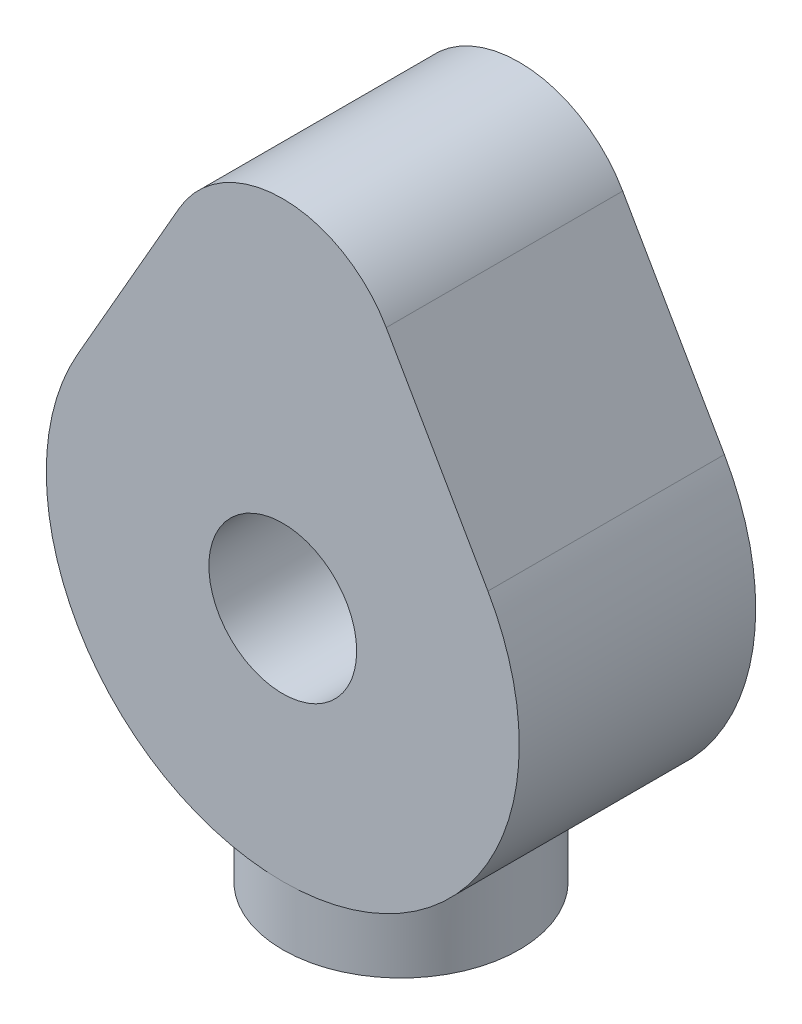
ISO-10303-21;
HEADER;
FILE_DESCRIPTION(('STEP AP214'),'2;1');
FILE_NAME('part.step','',(''),(''),'','','');
FILE_SCHEMA(('AUTOMOTIVE_DESIGN { 1 0 10303 214 1 1 1 1 }'));
ENDSEC;
DATA;
#1=APPLICATION_CONTEXT('core data for automotive mechanical design processes');
#2=APPLICATION_PROTOCOL_DEFINITION('international standard','automotive_design',2000,#1);
#3=PRODUCT_CONTEXT('',#1,'mechanical');
#4=PRODUCT('Part','Part','',(#3));
#5=PRODUCT_RELATED_PRODUCT_CATEGORY('part','',(#4));
#6=PRODUCT_DEFINITION_FORMATION('','',#4);
#7=PRODUCT_DEFINITION_CONTEXT('part definition',#1,'design');
#8=PRODUCT_DEFINITION('design','',#6,#7);
#9=PRODUCT_DEFINITION_SHAPE('','',#8);
#10=(LENGTH_UNIT() NAMED_UNIT(*) SI_UNIT(.MILLI.,.METRE.));
#11=(NAMED_UNIT(*) PLANE_ANGLE_UNIT() SI_UNIT($,.RADIAN.));
#12=(NAMED_UNIT(*) SI_UNIT($,.STERADIAN.) SOLID_ANGLE_UNIT());
#13=UNCERTAINTY_MEASURE_WITH_UNIT(LENGTH_MEASURE(1.E-05),#10,'distance_accuracy_value','');
#14=(GEOMETRIC_REPRESENTATION_CONTEXT(3) GLOBAL_UNCERTAINTY_ASSIGNED_CONTEXT((#13)) GLOBAL_UNIT_ASSIGNED_CONTEXT((#10,
#11,#12)) REPRESENTATION_CONTEXT('',''));
#15=CARTESIAN_POINT('',(0.,0.,0.));
#16=DIRECTION('',(0.,0.,1.));
#17=DIRECTION('',(1.,0.,0.));
#18=AXIS2_PLACEMENT_3D('',#15,#16,#17);
#19=CARTESIAN_POINT('',(0.,-50.,0.));
#20=DIRECTION('',(0.,1.,0.));
#21=DIRECTION('',(0.,0.,1.));
#22=AXIS2_PLACEMENT_3D('',#19,#20,#21);
#23=PLANE('',#22);
#24=CARTESIAN_POINT('',(0.,-50.,0.));
#25=DIRECTION('',(0.,1.,0.));
#26=DIRECTION('',(0.,0.,1.));
#27=AXIS2_PLACEMENT_3D('',#24,#25,#26);
#28=CIRCLE('',#27,20.);
#29=CARTESIAN_POINT('',(0.,-50.,20.));
#30=VERTEX_POINT('',#29);
#31=EDGE_CURVE('E132',#30,#30,#28,.T.);
#32=ORIENTED_EDGE('',*,*,#31,.F.);
#33=EDGE_LOOP('',(#32));
#34=FACE_BOUND('',#33,.T.);
#35=CARTESIAN_POINT('',(0.,-50.,0.));
#36=DIRECTION('',(0.,-1.,0.));
#37=DIRECTION('',(0.,0.,-1.));
#38=AXIS2_PLACEMENT_3D('',#35,#36,#37);
#39=CIRCLE('',#38,10.);
#40=CARTESIAN_POINT('',(0.,-50.,-10.));
#41=VERTEX_POINT('',#40);
#42=EDGE_CURVE('E191',#41,#41,#39,.T.);
#43=ORIENTED_EDGE('',*,*,#42,.F.);
#44=EDGE_LOOP('',(#43));
#45=FACE_BOUND('',#44,.T.);
#46=ADVANCED_FACE('F33',(#34,#45),#23,.F.);
#47=CARTESIAN_POINT('',(0.,0.,20.));
#48=DIRECTION('',(0.,0.,-1.));
#49=DIRECTION('',(-1.,0.,0.));
#50=AXIS2_PLACEMENT_3D('',#47,#48,#49);
#51=CYLINDRICAL_SURFACE('',#50,40.);
#52=CARTESIAN_POINT('',(0.,0.,20.));
#53=DIRECTION('',(0.,0.,1.));
#54=DIRECTION('',(1.,0.,0.));
#55=AXIS2_PLACEMENT_3D('',#52,#53,#54);
#56=CIRCLE('',#55,40.);
#57=CARTESIAN_POINT('',(0.,-40.,20.));
#58=VERTEX_POINT('',#57);
#59=CARTESIAN_POINT('',(34.7008119092264,19.8960712916015,20.));
#60=VERTEX_POINT('',#59);
#61=EDGE_CURVE('E174',#58,#60,#56,.T.);
#62=ORIENTED_EDGE('',*,*,#61,.F.);
#63=CARTESIAN_POINT('',(0.,-40.,20.));
#64=CARTESIAN_POINT('',(0.525955495309158,-39.9999984020735,19.9999982623809));
#65=CARTESIAN_POINT('',(1.05194776389316,-39.9896021674005,19.9792289721094));
#66=CARTESIAN_POINT('',(2.1000584622648,-39.9482790708451,19.8963883502823));
#67=CARTESIAN_POINT('',(2.62217510685011,-39.9173432774939,19.8342990510119));
#68=CARTESIAN_POINT('',(3.65926452101893,-39.8356724459412,19.669416179119));
#69=CARTESIAN_POINT('',(4.17422377794313,-39.7849041497218,19.5665542287244));
#70=CARTESIAN_POINT('',(5.1923636555662,-39.6648726897732,19.3213235720522));
#71=CARTESIAN_POINT('',(5.69554544879778,-39.5956113757509,19.1789588168648));
#72=CARTESIAN_POINT('',(6.68493673827045,-39.440606046303,18.8568619944931));
#73=CARTESIAN_POINT('',(7.17120492069962,-39.3549275595753,18.677278260756));
#74=CARTESIAN_POINT('',(8.12596863493543,-39.1689317521732,18.2821113609648));
#75=CARTESIAN_POINT('',(8.59446378382129,-39.0686141163229,18.0665274198246));
#76=CARTESIAN_POINT('',(9.51109783249333,-38.8556352457488,17.6012260637177));
#77=CARTESIAN_POINT('',(9.95924110879068,-38.742976682795,17.3515160340503));
#78=CARTESIAN_POINT('',(10.8331914713298,-38.5077498342666,16.8197401238515));
#79=CARTESIAN_POINT('',(11.2589965294644,-38.3851806514563,16.5376713128202));
#80=CARTESIAN_POINT('',(12.1114280320356,-38.1251058372724,15.9249873049685));
#81=CARTESIAN_POINT('',(12.5365475155568,-37.987145188738,15.5924680344565));
#82=CARTESIAN_POINT('',(13.3576238086493,-37.7062619973265,14.8951014231951));
#83=CARTESIAN_POINT('',(13.7535796129841,-37.5633392836627,14.5302529690522));
#84=CARTESIAN_POINT('',(14.5147245681412,-37.2758414912841,13.7699763380488));
#85=CARTESIAN_POINT('',(14.8798984189062,-37.1312656309511,13.37453313928));
#86=CARTESIAN_POINT('',(15.5776736613917,-36.8439755178979,12.5549154289558));
#87=CARTESIAN_POINT('',(15.9102597020839,-36.701262169722,12.1307275343761));
#88=CARTESIAN_POINT('',(16.5654339419528,-36.4105018826193,11.2215973279371));
#89=CARTESIAN_POINT('',(16.885233355286,-36.2629032277113,10.7344956827348));
#90=CARTESIAN_POINT('',(17.4822019569123,-35.978908696181,9.73204750758799));
#91=CARTESIAN_POINT('',(17.7593921236657,-35.8425073221447,9.21671504756661));
#92=CARTESIAN_POINT('',(18.2687755534357,-35.5855763271304,8.16060160021829));
#93=CARTESIAN_POINT('',(18.5009808934698,-35.4650424490192,7.61982749176702));
#94=CARTESIAN_POINT('',(18.9178904493833,-35.2444199123124,6.51622809145552));
#95=CARTESIAN_POINT('',(19.1025999287154,-35.1443289884985,5.95340525099053));
#96=CARTESIAN_POINT('',(19.4125091752965,-34.9740458186312,4.84416991997306));
#97=CARTESIAN_POINT('',(19.5406061549145,-34.9024240111369,4.29878748934329));
#98=CARTESIAN_POINT('',(19.75086442124,-34.7838755031915,3.19656707002509));
#99=CARTESIAN_POINT('',(19.833027672922,-34.7369477463717,2.63972957242357));
#100=CARTESIAN_POINT('',(19.9500955461198,-34.6698466392678,1.519970797152));
#101=CARTESIAN_POINT('',(19.9850401406704,-34.6496506594487,0.957055072508461));
#102=CARTESIAN_POINT('',(20.007216012279,-34.6368519800813,-0.170005002878221));
#103=CARTESIAN_POINT('',(19.9944518416021,-34.644246647894,-0.734149231266727));
#104=CARTESIAN_POINT('',(19.9258258183558,-34.683752706684,-1.79091472657764));
#105=CARTESIAN_POINT('',(19.8753086844342,-34.7127978098405,-2.28400999566694));
#106=CARTESIAN_POINT('',(19.7381397437616,-34.7909769339568,-3.26348526201604));
#107=CARTESIAN_POINT('',(19.6514913279473,-34.8401090697315,-3.74986588502405));
#108=CARTESIAN_POINT('',(19.443037128277,-34.9568668301204,-4.7128668190479));
#109=CARTESIAN_POINT('',(19.3212225365264,-35.0244970876425,-5.18948465275855));
#110=CARTESIAN_POINT('',(19.043705831017,-35.1761601127151,-6.13006796016611));
#111=CARTESIAN_POINT('',(18.8880019121776,-35.2601937539506,-6.59403275843009));
#112=CARTESIAN_POINT('',(18.5401581257189,-35.4443524571232,-7.51741518121851));
#113=CARTESIAN_POINT('',(18.3472621362356,-35.5448033610596,-7.97648237425849));
#114=CARTESIAN_POINT('',(17.928965335398,-35.7576181997024,-8.87686508191131));
#115=CARTESIAN_POINT('',(17.7035528986985,-35.8699863912804,-9.31817417513477));
#116=CARTESIAN_POINT('',(17.2217453818263,-36.1037834145776,-10.1811473523825));
#117=CARTESIAN_POINT('',(16.9653434339075,-36.2252142524277,-10.60280705301));
#118=CARTESIAN_POINT('',(16.4230793770433,-36.4742577002614,-11.4247489211605));
#119=CARTESIAN_POINT('',(16.1372187212183,-36.6018700051652,-11.8250321416514));
#120=CARTESIAN_POINT('',(15.4992958964165,-36.8769204872628,-12.652198617368));
#121=CARTESIAN_POINT('',(15.1434365215041,-37.0248188034542,-13.0760069635647));
#122=CARTESIAN_POINT('',(14.3979314861535,-37.3210457502805,-13.8926336443529));
#123=CARTESIAN_POINT('',(14.0082842982153,-37.4693744000769,-14.2854505763309));
#124=CARTESIAN_POINT('',(13.1968254432884,-37.7628128869945,-15.038294137795));
#125=CARTESIAN_POINT('',(12.7749919492543,-37.9079204520951,-15.3982981456179));
#126=CARTESIAN_POINT('',(11.9015900642709,-38.191135390742,-16.0829073614934));
#127=CARTESIAN_POINT('',(11.4500336472376,-38.329245544001,-16.4075266860173));
#128=CARTESIAN_POINT('',(10.4974553627396,-38.6012960666301,-17.0335917325386));
#129=CARTESIAN_POINT('',(9.99510749644099,-38.7347387181026,-17.3332416925276));
#130=CARTESIAN_POINT('',(8.96305995725755,-38.986480307297,-17.8887384732091));
#131=CARTESIAN_POINT('',(8.43335901213671,-39.1047785397354,-18.1445832540588));
#132=CARTESIAN_POINT('',(7.35052045530497,-39.3226984638096,-18.6095886062783));
#133=CARTESIAN_POINT('',(6.7973980130011,-39.4223320238495,-18.8187788603449));
#134=CARTESIAN_POINT('',(5.67164529023391,-39.5999620401594,-19.1881015579119));
#135=CARTESIAN_POINT('',(5.099017262336,-39.677960985414,-19.3482396449093));
#136=CARTESIAN_POINT('',(3.98720164165299,-39.8043826338148,-19.606131722384));
#137=CARTESIAN_POINT('',(3.44917316982603,-39.8547200827768,-19.7079544863071));
#138=CARTESIAN_POINT('',(2.36501188798831,-39.9337205093502,-19.8672303157948));
#139=CARTESIAN_POINT('',(1.81887952044227,-39.9623846658944,-19.9246857947506));
#140=CARTESIAN_POINT('',(0.72324290613407,-39.9972152184308,-19.9944526430536));
#141=CARTESIAN_POINT('',(0.173740095620136,-40.0033906096215,-20.0067820622174));
#142=CARTESIAN_POINT('',(-0.92419057742115,-39.9930894634341,-19.9861776191785));
#143=CARTESIAN_POINT('',(-1.47261848644562,-39.9766139285379,-19.9532457601443));
#144=CARTESIAN_POINT('',(-2.52139154289439,-39.923634267081,-19.8468758957505));
#145=CARTESIAN_POINT('',(-3.02216423520807,-39.8887842879419,-19.7767809232378));
#146=CARTESIAN_POINT('',(-4.01540678602407,-39.8010682287016,-19.5992599407683));
#147=CARTESIAN_POINT('',(-4.50787717661253,-39.7482033078017,-19.4918363327758));
#148=CARTESIAN_POINT('',(-5.48136857498477,-39.6256901924867,-19.2407722721667));
#149=CARTESIAN_POINT('',(-5.96238894437366,-39.5560410646668,-19.0971298053229));
#150=CARTESIAN_POINT('',(-6.91010293848646,-39.4015358531269,-18.7750097266352));
#151=CARTESIAN_POINT('',(-7.37679596029165,-39.3166791304706,-18.5965306511276));
#152=CARTESIAN_POINT('',(-8.30639914139648,-39.130994956507,-18.2007191617701));
#153=CARTESIAN_POINT('',(-8.76882149944907,-39.0297809280574,-17.9824235312199));
#154=CARTESIAN_POINT('',(-9.67344906544454,-38.815467201885,-17.5124022383474));
#155=CARTESIAN_POINT('',(-10.1156540957074,-38.7023673997328,-17.2606762822985));
#156=CARTESIAN_POINT('',(-10.9779473425004,-38.4666677014398,-16.7254970593208));
#157=CARTESIAN_POINT('',(-11.3980286356791,-38.3440648607605,-16.4420339463705));
#158=CARTESIAN_POINT('',(-12.2141818502455,-38.0919444279185,-15.8451696484874));
#159=CARTESIAN_POINT('',(-12.6102516617017,-37.9624262299663,-15.5317658388271));
#160=CARTESIAN_POINT('',(-13.4144484673574,-37.6862126417981,-14.8444984736278));
#161=CARTESIAN_POINT('',(-13.8199379336654,-37.5390796962588,-14.4677200352175));
#162=CARTESIAN_POINT('',(-14.5980879442184,-37.2433768374063,-13.6821610517212));
#163=CARTESIAN_POINT('',(-14.9707464600886,-37.0948068359368,-13.2733785322891));
#164=CARTESIAN_POINT('',(-15.6814902855054,-36.7999858258588,-12.4256561293184));
#165=CARTESIAN_POINT('',(-16.0195601033512,-36.6537358809282,-11.9867028786816));
#166=CARTESIAN_POINT('',(-16.6591396993238,-36.3675115698269,-11.0806458913586));
#167=CARTESIAN_POINT('',(-16.960632115893,-36.2275402035119,-10.6135289429463));
#168=CARTESIAN_POINT('',(-17.5385670688271,-35.9514421280783,-9.63013638298287));
#169=CARTESIAN_POINT('',(-17.8130759401747,-35.8158342014911,-9.11257468960894));
#170=CARTESIAN_POINT('',(-18.3167730157601,-35.5608707827718,-8.05233179362844));
#171=CARTESIAN_POINT('',(-18.545986567415,-35.4415062125134,-7.50966485104502));
#172=CARTESIAN_POINT('',(-18.9565535489441,-35.2236159110851,-6.40290087540963));
#173=CARTESIAN_POINT('',(-19.1379435504527,-35.1250742677182,-5.83882059743459));
#174=CARTESIAN_POINT('',(-19.4506018803025,-34.9529120161132,-4.6932334086418));
#175=CARTESIAN_POINT('',(-19.5818779692058,-34.8792875494405,-4.11172921111925));
#176=CARTESIAN_POINT('',(-19.7821512677084,-34.7660521740885,-2.99295044340003));
#177=CARTESIAN_POINT('',(-19.8559171496972,-34.7238546261086,-2.45678849964083));
#178=CARTESIAN_POINT('',(-19.9597538525093,-34.6642736285747,-1.37887867241344));
#179=CARTESIAN_POINT('',(-19.9898276449507,-34.6468884914625,-0.837131171358394));
#180=CARTESIAN_POINT('',(-20.0058193338474,-34.63765684696,0.247027138688521));
#181=CARTESIAN_POINT('',(-19.9917535623708,-34.6458008935224,0.789437628127308));
#182=CARTESIAN_POINT('',(-19.9197179789316,-34.6872679809353,1.87034420698098));
#183=CARTESIAN_POINT('',(-19.8617499643071,-34.7205899910114,2.40884045573197));
#184=CARTESIAN_POINT('',(-19.7103796808069,-34.8067187032581,3.42632818218793));
#185=CARTESIAN_POINT('',(-19.6208878161443,-34.8573619627895,3.90609324105171));
#186=CARTESIAN_POINT('',(-19.4077148769991,-34.9764992495754,4.85565155229128));
#187=CARTESIAN_POINT('',(-19.2840365265261,-35.0449918545533,5.32544559595627));
#188=CARTESIAN_POINT('',(-19.003715757486,-35.1977873125033,6.25246548720163));
#189=CARTESIAN_POINT('',(-18.8470706643695,-35.2820914481843,6.70969031165259));
#190=CARTESIAN_POINT('',(-18.5021293041308,-35.4641965231368,7.60943192979274));
#191=CARTESIAN_POINT('',(-18.3138213268244,-35.5620024535006,8.05194320904224));
#192=CARTESIAN_POINT('',(-17.893358939359,-35.7755075101083,8.94926640728481));
#193=CARTESIAN_POINT('',(-17.6591125277565,-35.8919663280285,9.40291703303953));
#194=CARTESIAN_POINT('',(-17.1578911973716,-36.1342528675245,10.2891181996718));
#195=CARTESIAN_POINT('',(-16.8909154185148,-36.2600808352722,10.7216681856411));
#196=CARTESIAN_POINT('',(-16.3256587085201,-36.5180697545457,11.5641839038469));
#197=CARTESIAN_POINT('',(-16.0273598441956,-36.6502343101261,11.9741364914935));
#198=CARTESIAN_POINT('',(-15.4011806538846,-36.9177399868863,12.7694857607962));
#199=CARTESIAN_POINT('',(-15.0733074988073,-37.0530803321721,13.1548883566514));
#200=CARTESIAN_POINT('',(-14.3476774582267,-37.3405191134944,13.945101118966));
#201=CARTESIAN_POINT('',(-13.9462727129583,-37.4926510381637,14.3465583211664));
#202=CARTESIAN_POINT('',(-13.1100029869322,-37.7931905607215,15.1145676799867));
#203=CARTESIAN_POINT('',(-12.6751351529993,-37.9415978396004,15.4811168542557));
#204=CARTESIAN_POINT('',(-11.7738674911855,-38.2308792747587,16.1771564685064));
#205=CARTESIAN_POINT('',(-11.3074491783242,-38.3717489267631,16.5066248769793));
#206=CARTESIAN_POINT('',(-10.3457908817124,-38.6421277118512,17.1257582515873));
#207=CARTESIAN_POINT('',(-9.85055256101203,-38.7716374993732,17.4154255112003));
#208=CARTESIAN_POINT('',(-8.8304447952247,-39.0166672192426,17.9543405914455));
#209=CARTESIAN_POINT('',(-8.30538870726552,-39.1320804342946,18.2032844105791));
#210=CARTESIAN_POINT('',(-7.23229606753359,-39.3445425296377,18.6556405850082));
#211=CARTESIAN_POINT('',(-6.68425623664172,-39.4415887785278,18.8590464169238));
#212=CARTESIAN_POINT('',(-5.57078900539141,-39.6141755158587,19.2173750047436));
#213=CARTESIAN_POINT('',(-5.00540887409184,-39.6897695534438,19.3724185806038));
#214=CARTESIAN_POINT('',(-3.86094644442428,-39.8173857455874,19.6325521753264));
#215=CARTESIAN_POINT('',(-3.28187274376231,-39.8694222981838,19.7376727084559));
#216=CARTESIAN_POINT('',(-2.2521670464681,-39.939055332577,19.8778978078802));
#217=CARTESIAN_POINT('',(-1.80330336007387,-39.9618696173926,19.9236469328593));
#218=CARTESIAN_POINT('',(-0.902968863044381,-39.9923428461159,19.9846991949116));
#219=CARTESIAN_POINT('',(-0.45149798079361,-40.0000013717142,20.000001491631));
#220=CARTESIAN_POINT('',(0.,-40.,20.));
#221=B_SPLINE_CURVE_WITH_KNOTS('',3,(#63,#64,#65,#66,#67,#68,#69,#70,#71,#72,#73,#74,#75,#76,
#77,#78,#79,#80,#81,#82,#83,#84,#85,#86,#87,#88,#89,#90,#91,#92,#93,#94,#95,#96,#97,#98,#99,
#100,#101,#102,#103,#104,#105,#106,#107,#108,#109,#110,#111,#112,#113,#114,#115,#116,#117,#118,
#119,#120,#121,#122,#123,#124,#125,#126,#127,#128,#129,#130,#131,#132,#133,#134,#135,#136,#137,
#138,#139,#140,#141,#142,#143,#144,#145,#146,#147,#148,#149,#150,#151,#152,#153,#154,#155,#156,
#157,#158,#159,#160,#161,#162,#163,#164,#165,#166,#167,#168,#169,#170,#171,#172,#173,#174,#175,
#176,#177,#178,#179,#180,#181,#182,#183,#184,#185,#186,#187,#188,#189,#190,#191,#192,#193,#194,
#195,#196,#197,#198,#199,#200,#201,#202,#203,#204,#205,#206,#207,#208,#209,#210,#211,#212,#213,
#214,#215,#216,#217,#218,#219,#220),.UNSPECIFIED.,.T.,.F.,(4,2,2,2,2,2,2,2,2,2,2,2,2,2,2,2,2,2,
2,2,2,2,2,2,2,2,2,2,2,2,2,2,2,2,2,2,2,2,2,2,2,2,2,2,2,2,2,2,2,2,2,2,2,2,2,2,2,2,2,2,2,2,2,2,2,2,
2,2,2,2,2,2,2,2,2,2,2,2,4),(0.,1.577421178502,3.15552873607903,4.73629413277893,
6.31690147748929,7.8913265620635,9.46578554845364,11.03990434081,12.614165802382,
14.283611125627,15.9531139657086,17.623441792188,19.2945527091499,21.0956182288859,
22.8957941426434,24.6954860937523,26.4949785184317,28.186906492579,29.8787620831016,
31.5691845311993,33.2594456870341,34.7472712538931,36.2349572190898,37.7230161212401,
39.2111543027408,40.7335431715167,42.2564776830213,43.7797503209208,45.3029478557305,
47.019529486175,48.7361887613817,50.4540227113041,52.1711688156636,53.968685154222,
55.7662851736146,57.5627382345732,59.3589845342626,61.0064389586203,62.6538037621639,
64.3005095698929,65.947142500251,67.4659444431998,68.9846486747565,70.5034373841301,
72.0222899193056,73.5844756323281,75.1466750719843,76.7093605127759,78.272183071078,
79.9885258414882,81.7049745774131,83.4221887473444,85.140214834696,86.941867404936,
88.7425088911977,90.5417693701602,92.3407511053169,93.9670431899161,95.5932246607814,
97.2188044996406,98.8443177915912,100.31467320725,101.784911497437,103.255269112177,
104.726171724143,106.295593599237,107.865056725022,109.435423355,111.005410234871,
112.766606050411,114.527952198152,116.290339384542,118.052624973548,119.827518576261,
121.602666272496,123.373343053535,125.142936153316,126.49701045587,127.8511221313),.UNSPECIFIED.);
#222=CARTESIAN_POINT('',(0.,-40.,-20.));
#223=VERTEX_POINT('',#222);
#224=EDGE_CURVE('E47',#58,#223,#221,.T.);
#225=ORIENTED_EDGE('',*,*,#224,.T.);
#226=CARTESIAN_POINT('',(0.,0.,-20.));
#227=DIRECTION('',(0.,0.,1.));
#228=DIRECTION('',(1.,0.,0.));
#229=AXIS2_PLACEMENT_3D('',#226,#227,#228);
#230=CIRCLE('',#229,40.);
#231=CARTESIAN_POINT('',(34.7008119092264,19.8960712916015,-20.));
#232=VERTEX_POINT('',#231);
#233=EDGE_CURVE('E155',#223,#232,#230,.T.);
#234=ORIENTED_EDGE('',*,*,#233,.T.);
#235=DIRECTION('',(0.,0.,-1.));
#236=VECTOR('',#235,1.);
#237=CARTESIAN_POINT('',(34.7008119092264,19.8960712916015,20.));
#238=LINE('',#237,#236);
#239=EDGE_CURVE('E162',#60,#232,#238,.T.);
#240=ORIENTED_EDGE('',*,*,#239,.F.);
#241=EDGE_LOOP('',(#62,#225,#234,#240));
#242=FACE_BOUND('',#241,.T.);
#243=ADVANCED_FACE('F107',(#242),#51,.T.);
#244=CARTESIAN_POINT('',(0.,39.8622643445528,20.));
#245=DIRECTION('',(0.,0.,-1.));
#246=DIRECTION('',(-1.,0.,0.));
#247=AXIS2_PLACEMENT_3D('',#244,#245,#246);
#248=CYLINDRICAL_SURFACE('',#247,20.1724386689028);
#249=CARTESIAN_POINT('',(0.,39.8622643445528,-20.));
#250=DIRECTION('',(0.,0.,1.));
#251=DIRECTION('',(-1.,0.,0.));
#252=AXIS2_PLACEMENT_3D('',#249,#250,#251);
#253=CIRCLE('',#252,20.1724386689028);
#254=CARTESIAN_POINT('',(17.5,49.8960712916016,-20.));
#255=VERTEX_POINT('',#254);
#256=CARTESIAN_POINT('',(-17.5,49.8960712916016,-20.));
#257=VERTEX_POINT('',#256);
#258=EDGE_CURVE('E156',#255,#257,#253,.T.);
#259=ORIENTED_EDGE('',*,*,#258,.T.);
#260=DIRECTION('',(0.,0.,-1.));
#261=VECTOR('',#260,1.);
#262=CARTESIAN_POINT('',(-17.5,49.8960712916016,20.));
#263=LINE('',#262,#261);
#264=CARTESIAN_POINT('',(-17.5,49.8960712916016,20.));
#265=VERTEX_POINT('',#264);
#266=EDGE_CURVE('E11',#265,#257,#263,.T.);
#267=ORIENTED_EDGE('',*,*,#266,.F.);
#268=CARTESIAN_POINT('',(0.,39.8622643445528,20.));
#269=DIRECTION('',(0.,0.,1.));
#270=DIRECTION('',(-1.,0.,0.));
#271=AXIS2_PLACEMENT_3D('',#268,#269,#270);
#272=CIRCLE('',#271,20.1724386689028);
#273=CARTESIAN_POINT('',(17.5,49.8960712916016,20.));
#274=VERTEX_POINT('',#273);
#275=EDGE_CURVE('E134',#274,#265,#272,.T.);
#276=ORIENTED_EDGE('',*,*,#275,.F.);
#277=DIRECTION('',(0.,0.,-1.));
#278=VECTOR('',#277,1.);
#279=CARTESIAN_POINT('',(17.5,49.8960712916016,20.));
#280=LINE('',#279,#278);
#281=EDGE_CURVE('E168',#274,#255,#280,.T.);
#282=ORIENTED_EDGE('',*,*,#281,.T.);
#283=EDGE_LOOP('',(#259,#267,#276,#282));
#284=FACE_BOUND('',#283,.T.);
#285=ADVANCED_FACE('F35',(#284),#248,.T.);
#286=CARTESIAN_POINT('',(-17.5,49.8960712916016,20.));
#287=DIRECTION('',(0.86752029773066,-0.497401782290039,0.));
#288=DIRECTION('',(0.497401782290039,0.86752029773066,0.));
#289=AXIS2_PLACEMENT_3D('',#286,#287,#288);
#290=PLANE('',#289);
#291=DIRECTION('',(-0.497401782290039,-0.86752029773066,0.));
#292=VECTOR('',#291,1.);
#293=CARTESIAN_POINT('',(-17.5,49.8960712916016,-20.));
#294=LINE('',#293,#292);
#295=CARTESIAN_POINT('',(-34.7008119092264,19.8960712916015,-20.));
#296=VERTEX_POINT('',#295);
#297=EDGE_CURVE('E147',#257,#296,#294,.T.);
#298=ORIENTED_EDGE('',*,*,#297,.T.);
#299=DIRECTION('',(0.,0.,-1.));
#300=VECTOR('',#299,1.);
#301=CARTESIAN_POINT('',(-34.7008119092264,19.8960712916015,20.));
#302=LINE('',#301,#300);
#303=CARTESIAN_POINT('',(-34.7008119092264,19.8960712916015,20.));
#304=VERTEX_POINT('',#303);
#305=EDGE_CURVE('E41',#304,#296,#302,.T.);
#306=ORIENTED_EDGE('',*,*,#305,.F.);
#307=DIRECTION('',(-0.497401782290039,-0.86752029773066,0.));
#308=VECTOR('',#307,1.);
#309=CARTESIAN_POINT('',(-17.5,49.8960712916016,20.));
#310=LINE('',#309,#308);
#311=EDGE_CURVE('E84',#265,#304,#310,.T.);
#312=ORIENTED_EDGE('',*,*,#311,.F.);
#313=ORIENTED_EDGE('',*,*,#266,.T.);
#314=EDGE_LOOP('',(#298,#306,#312,#313));
#315=FACE_BOUND('',#314,.T.);
#316=ADVANCED_FACE('F140',(#315),#290,.F.);
#317=EDGE_CURVE('E159',#296,#223,#230,.T.);
#318=ORIENTED_EDGE('',*,*,#317,.T.);
#319=EDGE_CURVE('E127',#223,#58,#221,.T.);
#320=ORIENTED_EDGE('',*,*,#319,.T.);
#321=EDGE_CURVE('E161',#304,#58,#56,.T.);
#322=ORIENTED_EDGE('',*,*,#321,.F.);
#323=ORIENTED_EDGE('',*,*,#305,.T.);
#324=EDGE_LOOP('',(#318,#320,#322,#323));
#325=FACE_BOUND('',#324,.T.);
#326=ADVANCED_FACE('F115',(#325),#51,.T.);
#327=CARTESIAN_POINT('',(17.5,49.8960712916016,20.));
#328=DIRECTION('',(-0.86752029773066,-0.497401782290039,0.));
#329=DIRECTION('',(0.497401782290039,-0.86752029773066,0.));
#330=AXIS2_PLACEMENT_3D('',#327,#328,#329);
#331=PLANE('',#330);
#332=DIRECTION('',(-0.497401782290039,0.86752029773066,0.));
#333=VECTOR('',#332,1.);
#334=CARTESIAN_POINT('',(17.5,49.8960712916016,-20.));
#335=LINE('',#334,#333);
#336=EDGE_CURVE('E77',#232,#255,#335,.T.);
#337=ORIENTED_EDGE('',*,*,#336,.T.);
#338=ORIENTED_EDGE('',*,*,#281,.F.);
#339=DIRECTION('',(-0.497401782290039,0.86752029773066,0.));
#340=VECTOR('',#339,1.);
#341=CARTESIAN_POINT('',(17.5,49.8960712916016,20.));
#342=LINE('',#341,#340);
#343=EDGE_CURVE('E56',#60,#274,#342,.T.);
#344=ORIENTED_EDGE('',*,*,#343,.F.);
#345=ORIENTED_EDGE('',*,*,#239,.T.);
#346=EDGE_LOOP('',(#337,#338,#344,#345));
#347=FACE_BOUND('',#346,.T.);
#348=ADVANCED_FACE('F139',(#347),#331,.F.);
#349=CARTESIAN_POINT('',(0.,39.8622643445528,20.));
#350=DIRECTION('',(0.,0.,-1.));
#351=DIRECTION('',(-1.,0.,0.));
#352=AXIS2_PLACEMENT_3D('',#349,#350,#351);
#353=PLANE('',#352);
#354=CARTESIAN_POINT('',(0.,0.,20.));
#355=DIRECTION('',(0.,0.,1.));
#356=DIRECTION('',(1.,0.,0.));
#357=AXIS2_PLACEMENT_3D('',#354,#355,#356);
#358=CIRCLE('',#357,12.5);
#359=CARTESIAN_POINT('',(12.5,0.,20.));
#360=VERTEX_POINT('',#359);
#361=EDGE_CURVE('E185',#360,#360,#358,.T.);
#362=ORIENTED_EDGE('',*,*,#361,.F.);
#363=EDGE_LOOP('',(#362));
#364=FACE_BOUND('',#363,.T.);
#365=ORIENTED_EDGE('',*,*,#275,.T.);
#366=ORIENTED_EDGE('',*,*,#311,.T.);
#367=ORIENTED_EDGE('',*,*,#321,.T.);
#368=ORIENTED_EDGE('',*,*,#61,.T.);
#369=ORIENTED_EDGE('',*,*,#343,.T.);
#370=EDGE_LOOP('',(#365,#366,#367,#368,#369));
#371=FACE_BOUND('',#370,.T.);
#372=ADVANCED_FACE('F124',(#364,#371),#353,.F.);
#373=CARTESIAN_POINT('',(0.,39.8622643445528,-20.));
#374=DIRECTION('',(0.,0.,-1.));
#375=DIRECTION('',(-1.,0.,0.));
#376=AXIS2_PLACEMENT_3D('',#373,#374,#375);
#377=PLANE('',#376);
#378=CARTESIAN_POINT('',(0.,0.,-20.));
#379=DIRECTION('',(0.,0.,1.));
#380=DIRECTION('',(1.,0.,0.));
#381=AXIS2_PLACEMENT_3D('',#378,#379,#380);
#382=CIRCLE('',#381,12.5);
#383=CARTESIAN_POINT('',(12.5,0.,-20.));
#384=VERTEX_POINT('',#383);
#385=EDGE_CURVE('E187',#384,#384,#382,.T.);
#386=ORIENTED_EDGE('',*,*,#385,.T.);
#387=EDGE_LOOP('',(#386));
#388=FACE_BOUND('',#387,.T.);
#389=ORIENTED_EDGE('',*,*,#258,.F.);
#390=ORIENTED_EDGE('',*,*,#336,.F.);
#391=ORIENTED_EDGE('',*,*,#233,.F.);
#392=ORIENTED_EDGE('',*,*,#317,.F.);
#393=ORIENTED_EDGE('',*,*,#297,.F.);
#394=EDGE_LOOP('',(#389,#390,#391,#392,#393));
#395=FACE_BOUND('',#394,.T.);
#396=ADVANCED_FACE('F122',(#388,#395),#377,.T.);
#397=CARTESIAN_POINT('',(0.,-50.,0.));
#398=DIRECTION('',(0.,1.,0.));
#399=DIRECTION('',(0.,0.,1.));
#400=AXIS2_PLACEMENT_3D('',#397,#398,#399);
#401=CYLINDRICAL_SURFACE('',#400,20.);
#402=ORIENTED_EDGE('',*,*,#31,.T.);
#403=EDGE_LOOP('',(#402));
#404=FACE_BOUND('',#403,.T.);
#405=ORIENTED_EDGE('',*,*,#224,.F.);
#406=ORIENTED_EDGE('',*,*,#319,.F.);
#407=EDGE_LOOP('',(#405,#406));
#408=FACE_BOUND('',#407,.T.);
#409=ADVANCED_FACE('F102',(#404,#408),#401,.T.);
#410=CARTESIAN_POINT('',(0.,0.,-20.));
#411=DIRECTION('',(0.,0.,1.));
#412=DIRECTION('',(1.,0.,0.));
#413=AXIS2_PLACEMENT_3D('',#410,#411,#412);
#414=CYLINDRICAL_SURFACE('',#413,12.5);
#415=ORIENTED_EDGE('',*,*,#385,.F.);
#416=EDGE_LOOP('',(#415));
#417=FACE_BOUND('',#416,.T.);
#418=ORIENTED_EDGE('',*,*,#361,.T.);
#419=EDGE_LOOP('',(#418));
#420=FACE_BOUND('',#419,.T.);
#421=ADVANCED_FACE('F93',(#417,#420),#414,.F.);
#422=CARTESIAN_POINT('',(0.,-20.,0.));
#423=DIRECTION('',(0.,-1.,0.));
#424=DIRECTION('',(0.,0.,-1.));
#425=AXIS2_PLACEMENT_3D('',#422,#423,#424);
#426=CONICAL_SURFACE('',#425,0.,1.04719755119659);
#427=CARTESIAN_POINT('',(0.,-25.7735026918963,0.));
#428=DIRECTION('',(0.,-1.,0.));
#429=DIRECTION('',(0.,0.,-1.));
#430=AXIS2_PLACEMENT_3D('',#427,#428,#429);
#431=CIRCLE('',#430,10.);
#432=CARTESIAN_POINT('',(0.,-25.7735026918963,-10.));
#433=VERTEX_POINT('',#432);
#434=EDGE_CURVE('E188',#433,#433,#431,.T.);
#435=ORIENTED_EDGE('',*,*,#434,.T.);
#436=EDGE_LOOP('',(#435));
#437=FACE_BOUND('',#436,.T.);
#438=CARTESIAN_POINT('',(0.,-20.,0.));
#439=VERTEX_POINT('',#438);
#440=VERTEX_LOOP('',#439);
#441=FACE_BOUND('',#440,.T.);
#442=ADVANCED_FACE('F90',(#437,#441),#426,.F.);
#443=CARTESIAN_POINT('',(0.,-50.,0.));
#444=DIRECTION('',(0.,-1.,0.));
#445=DIRECTION('',(0.,0.,-1.));
#446=AXIS2_PLACEMENT_3D('',#443,#444,#445);
#447=CYLINDRICAL_SURFACE('',#446,10.);
#448=ORIENTED_EDGE('',*,*,#42,.T.);
#449=EDGE_LOOP('',(#448));
#450=FACE_BOUND('',#449,.T.);
#451=ORIENTED_EDGE('',*,*,#434,.F.);
#452=EDGE_LOOP('',(#451));
#453=FACE_BOUND('',#452,.T.);
#454=ADVANCED_FACE('F92',(#450,#453),#447,.F.);
#455=CLOSED_SHELL('',(#46,#243,#285,#316,#326,#348,#372,#396,#409,#421,#442,#454));
#456=MANIFOLD_SOLID_BREP('B2',#455);
#457=ADVANCED_BREP_SHAPE_REPRESENTATION('',(#18,#456),#14);
#458=SHAPE_DEFINITION_REPRESENTATION(#9,#457);
ENDSEC;
END-ISO-10303-21;
